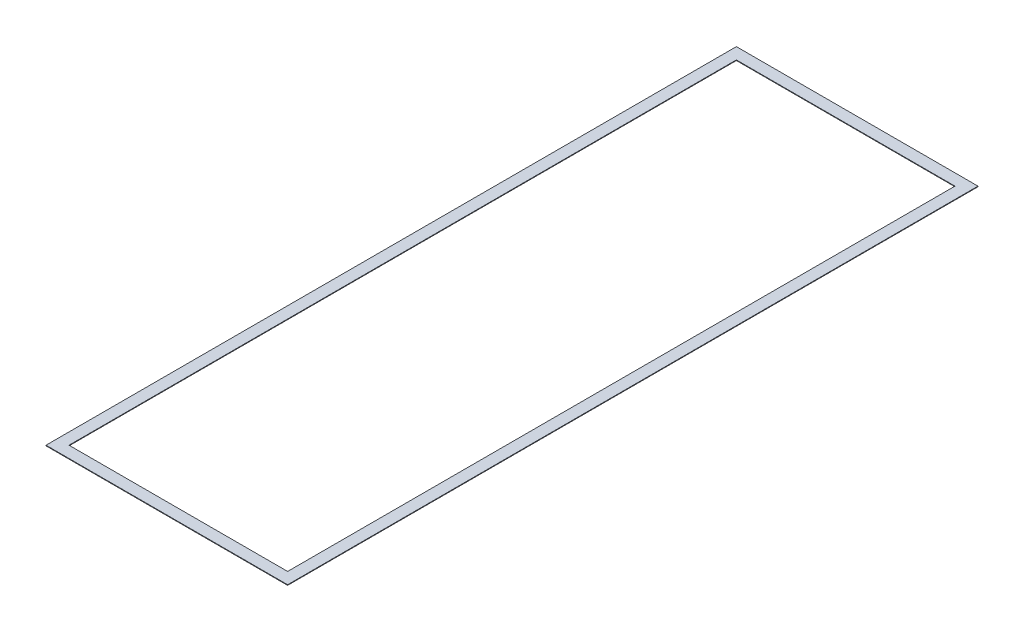
ISO-10303-21;
HEADER;
FILE_DESCRIPTION(('STEP AP214'),'2;1');
FILE_NAME('part.step','',(''),(''),'','','');
FILE_SCHEMA(('AUTOMOTIVE_DESIGN { 1 0 10303 214 1 1 1 1 }'));
ENDSEC;
DATA;
#1=APPLICATION_CONTEXT('core data for automotive mechanical design processes');
#2=APPLICATION_PROTOCOL_DEFINITION('international standard','automotive_design',2000,#1);
#3=PRODUCT_CONTEXT('',#1,'mechanical');
#4=PRODUCT('Part','Part','',(#3));
#5=PRODUCT_RELATED_PRODUCT_CATEGORY('part','',(#4));
#6=PRODUCT_DEFINITION_FORMATION('','',#4);
#7=PRODUCT_DEFINITION_CONTEXT('part definition',#1,'design');
#8=PRODUCT_DEFINITION('design','',#6,#7);
#9=PRODUCT_DEFINITION_SHAPE('','',#8);
#10=(LENGTH_UNIT() NAMED_UNIT(*) SI_UNIT(.MILLI.,.METRE.));
#11=(NAMED_UNIT(*) PLANE_ANGLE_UNIT() SI_UNIT($,.RADIAN.));
#12=(NAMED_UNIT(*) SI_UNIT($,.STERADIAN.) SOLID_ANGLE_UNIT());
#13=UNCERTAINTY_MEASURE_WITH_UNIT(LENGTH_MEASURE(1.E-05),#10,'distance_accuracy_value','');
#14=(GEOMETRIC_REPRESENTATION_CONTEXT(3) GLOBAL_UNCERTAINTY_ASSIGNED_CONTEXT((#13)) GLOBAL_UNIT_ASSIGNED_CONTEXT((#10,
#11,#12)) REPRESENTATION_CONTEXT('',''));
#15=CARTESIAN_POINT('',(0.,0.,0.));
#16=DIRECTION('',(0.,0.,1.));
#17=DIRECTION('',(1.,0.,0.));
#18=AXIS2_PLACEMENT_3D('',#15,#16,#17);
#19=CARTESIAN_POINT('',(0.,0.,0.));
#20=DIRECTION('',(0.,1.,0.));
#21=DIRECTION('',(0.,0.,1.));
#22=AXIS2_PLACEMENT_3D('',#19,#20,#21);
#23=PLANE('',#22);
#24=DIRECTION('',(1.,0.,0.));
#25=VECTOR('',#24,1.);
#26=CARTESIAN_POINT('',(-50.8,0.,-2997.2));
#27=LINE('',#26,#25);
#28=CARTESIAN_POINT('',(-1016.,0.,-2997.2));
#29=VERTEX_POINT('',#28);
#30=CARTESIAN_POINT('',(-50.8,0.,-2997.2));
#31=VERTEX_POINT('',#30);
#32=EDGE_CURVE('E109',#29,#31,#27,.T.);
#33=ORIENTED_EDGE('',*,*,#32,.F.);
#34=DIRECTION('',(0.,0.,-1.));
#35=VECTOR('',#34,1.);
#36=CARTESIAN_POINT('',(-1016.,0.,-50.8));
#37=LINE('',#36,#35);
#38=CARTESIAN_POINT('',(-1016.,0.,-50.8));
#39=VERTEX_POINT('',#38);
#40=EDGE_CURVE('E123',#39,#29,#37,.T.);
#41=ORIENTED_EDGE('',*,*,#40,.F.);
#42=DIRECTION('',(-1.,0.,0.));
#43=VECTOR('',#42,1.);
#44=CARTESIAN_POINT('',(-50.8,0.,-50.8));
#45=LINE('',#44,#43);
#46=CARTESIAN_POINT('',(-50.8,0.,-50.8));
#47=VERTEX_POINT('',#46);
#48=EDGE_CURVE('E118',#47,#39,#45,.T.);
#49=ORIENTED_EDGE('',*,*,#48,.F.);
#50=DIRECTION('',(0.,0.,1.));
#51=VECTOR('',#50,1.);
#52=CARTESIAN_POINT('',(-50.8,0.,-50.8));
#53=LINE('',#52,#51);
#54=EDGE_CURVE('E112',#31,#47,#53,.T.);
#55=ORIENTED_EDGE('',*,*,#54,.F.);
#56=EDGE_LOOP('',(#33,#41,#49,#55));
#57=FACE_BOUND('',#56,.T.);
#58=DIRECTION('',(-1.,0.,0.));
#59=VECTOR('',#58,1.);
#60=CARTESIAN_POINT('',(0.,0.,0.));
#61=LINE('',#60,#59);
#62=CARTESIAN_POINT('',(0.,0.,0.));
#63=VERTEX_POINT('',#62);
#64=CARTESIAN_POINT('',(-1066.8,0.,1.3064532053304E-13));
#65=VERTEX_POINT('',#64);
#66=EDGE_CURVE('E107',#63,#65,#61,.T.);
#67=ORIENTED_EDGE('',*,*,#66,.T.);
#68=DIRECTION('',(0.,0.,-1.));
#69=VECTOR('',#68,1.);
#70=CARTESIAN_POINT('',(-1066.8,0.,1.3064532053304E-13));
#71=LINE('',#70,#69);
#72=CARTESIAN_POINT('',(-1066.8,0.,-3048.));
#73=VERTEX_POINT('',#72);
#74=EDGE_CURVE('E93',#65,#73,#71,.T.);
#75=ORIENTED_EDGE('',*,*,#74,.T.);
#76=DIRECTION('',(1.,0.,0.));
#77=VECTOR('',#76,1.);
#78=CARTESIAN_POINT('',(0.,0.,-3048.));
#79=LINE('',#78,#77);
#80=CARTESIAN_POINT('',(0.,0.,-3048.));
#81=VERTEX_POINT('',#80);
#82=EDGE_CURVE('E80',#73,#81,#79,.T.);
#83=ORIENTED_EDGE('',*,*,#82,.T.);
#84=DIRECTION('',(0.,0.,1.));
#85=VECTOR('',#84,1.);
#86=CARTESIAN_POINT('',(0.,0.,0.));
#87=LINE('',#86,#85);
#88=EDGE_CURVE('E20',#81,#63,#87,.T.);
#89=ORIENTED_EDGE('',*,*,#88,.T.);
#90=EDGE_LOOP('',(#67,#75,#83,#89));
#91=FACE_BOUND('',#90,.T.);
#92=ADVANCED_FACE('F17',(#57,#91),#23,.F.);
#93=CARTESIAN_POINT('',(0.,2.54,0.));
#94=DIRECTION('',(-1.,0.,0.));
#95=DIRECTION('',(0.,0.,1.));
#96=AXIS2_PLACEMENT_3D('',#93,#94,#95);
#97=PLANE('',#96);
#98=DIRECTION('',(0.,1.,0.));
#99=VECTOR('',#98,1.);
#100=CARTESIAN_POINT('',(0.,2.54,-3048.));
#101=LINE('',#100,#99);
#102=CARTESIAN_POINT('',(0.,2.54,-3048.));
#103=VERTEX_POINT('',#102);
#104=EDGE_CURVE('E86',#81,#103,#101,.T.);
#105=ORIENTED_EDGE('',*,*,#104,.T.);
#106=DIRECTION('',(0.,0.,1.));
#107=VECTOR('',#106,1.);
#108=CARTESIAN_POINT('',(0.,2.54,0.));
#109=LINE('',#108,#107);
#110=CARTESIAN_POINT('',(0.,2.54,0.));
#111=VERTEX_POINT('',#110);
#112=EDGE_CURVE('E130',#111,#103,#109,.F.);
#113=ORIENTED_EDGE('',*,*,#112,.F.);
#114=DIRECTION('',(0.,1.,0.));
#115=VECTOR('',#114,1.);
#116=CARTESIAN_POINT('',(0.,2.54,0.));
#117=LINE('',#116,#115);
#118=EDGE_CURVE('E89',#111,#63,#117,.F.);
#119=ORIENTED_EDGE('',*,*,#118,.T.);
#120=ORIENTED_EDGE('',*,*,#88,.F.);
#121=EDGE_LOOP('',(#105,#113,#119,#120));
#122=FACE_BOUND('',#121,.T.);
#123=ADVANCED_FACE('F85',(#122),#97,.F.);
#124=CARTESIAN_POINT('',(0.,2.54,-3048.));
#125=DIRECTION('',(0.,0.,1.));
#126=DIRECTION('',(1.,0.,0.));
#127=AXIS2_PLACEMENT_3D('',#124,#125,#126);
#128=PLANE('',#127);
#129=DIRECTION('',(0.,1.,0.));
#130=VECTOR('',#129,1.);
#131=CARTESIAN_POINT('',(-1066.8,2.54,-3048.));
#132=LINE('',#131,#130);
#133=CARTESIAN_POINT('',(-1066.8,2.54,-3048.));
#134=VERTEX_POINT('',#133);
#135=EDGE_CURVE('E95',#73,#134,#132,.T.);
#136=ORIENTED_EDGE('',*,*,#135,.T.);
#137=DIRECTION('',(1.,0.,0.));
#138=VECTOR('',#137,1.);
#139=CARTESIAN_POINT('',(0.,2.54,-3048.));
#140=LINE('',#139,#138);
#141=EDGE_CURVE('E99',#103,#134,#140,.F.);
#142=ORIENTED_EDGE('',*,*,#141,.F.);
#143=ORIENTED_EDGE('',*,*,#104,.F.);
#144=ORIENTED_EDGE('',*,*,#82,.F.);
#145=EDGE_LOOP('',(#136,#142,#143,#144));
#146=FACE_BOUND('',#145,.T.);
#147=ADVANCED_FACE('F97',(#146),#128,.F.);
#148=CARTESIAN_POINT('',(-1066.8,2.54,1.3064532053304E-13));
#149=DIRECTION('',(1.,0.,0.));
#150=DIRECTION('',(0.,0.,-1.));
#151=AXIS2_PLACEMENT_3D('',#148,#149,#150);
#152=PLANE('',#151);
#153=DIRECTION('',(0.,1.,0.));
#154=VECTOR('',#153,1.);
#155=CARTESIAN_POINT('',(-1066.8,2.54,1.3064532053304E-13));
#156=LINE('',#155,#154);
#157=CARTESIAN_POINT('',(-1066.8,2.54,1.3064532053304E-13));
#158=VERTEX_POINT('',#157);
#159=EDGE_CURVE('E104',#65,#158,#156,.T.);
#160=ORIENTED_EDGE('',*,*,#159,.T.);
#161=DIRECTION('',(0.,0.,1.));
#162=VECTOR('',#161,1.);
#163=CARTESIAN_POINT('',(-1066.8,2.54,0.));
#164=LINE('',#163,#162);
#165=EDGE_CURVE('E133',#134,#158,#164,.T.);
#166=ORIENTED_EDGE('',*,*,#165,.F.);
#167=ORIENTED_EDGE('',*,*,#135,.F.);
#168=ORIENTED_EDGE('',*,*,#74,.F.);
#169=EDGE_LOOP('',(#160,#166,#167,#168));
#170=FACE_BOUND('',#169,.T.);
#171=ADVANCED_FACE('F176',(#170),#152,.F.);
#172=CARTESIAN_POINT('',(0.,2.54,0.));
#173=DIRECTION('',(0.,0.,-1.));
#174=DIRECTION('',(-1.,0.,0.));
#175=AXIS2_PLACEMENT_3D('',#172,#173,#174);
#176=PLANE('',#175);
#177=ORIENTED_EDGE('',*,*,#118,.F.);
#178=DIRECTION('',(1.,0.,0.));
#179=VECTOR('',#178,1.);
#180=CARTESIAN_POINT('',(0.,2.54,1.3064532053304E-13));
#181=LINE('',#180,#179);
#182=EDGE_CURVE('E136',#158,#111,#181,.T.);
#183=ORIENTED_EDGE('',*,*,#182,.F.);
#184=ORIENTED_EDGE('',*,*,#159,.F.);
#185=ORIENTED_EDGE('',*,*,#66,.F.);
#186=EDGE_LOOP('',(#177,#183,#184,#185));
#187=FACE_BOUND('',#186,.T.);
#188=ADVANCED_FACE('F173',(#187),#176,.F.);
#189=CARTESIAN_POINT('',(-50.8,2.54,-2997.2));
#190=DIRECTION('',(0.,0.,1.));
#191=DIRECTION('',(1.,0.,0.));
#192=AXIS2_PLACEMENT_3D('',#189,#190,#191);
#193=PLANE('',#192);
#194=DIRECTION('',(1.,0.,0.));
#195=VECTOR('',#194,1.);
#196=CARTESIAN_POINT('',(0.,2.54,-2997.2));
#197=LINE('',#196,#195);
#198=CARTESIAN_POINT('',(-1016.,2.54,-2997.2));
#199=VERTEX_POINT('',#198);
#200=CARTESIAN_POINT('',(-50.8,2.54,-2997.2));
#201=VERTEX_POINT('',#200);
#202=EDGE_CURVE('E139',#199,#201,#197,.T.);
#203=ORIENTED_EDGE('',*,*,#202,.F.);
#204=DIRECTION('',(0.,1.,0.));
#205=VECTOR('',#204,1.);
#206=CARTESIAN_POINT('',(-1016.,2.54,-2997.2));
#207=LINE('',#206,#205);
#208=EDGE_CURVE('E126',#29,#199,#207,.T.);
#209=ORIENTED_EDGE('',*,*,#208,.F.);
#210=ORIENTED_EDGE('',*,*,#32,.T.);
#211=DIRECTION('',(0.,1.,0.));
#212=VECTOR('',#211,1.);
#213=CARTESIAN_POINT('',(-50.8,2.54,-2997.2));
#214=LINE('',#213,#212);
#215=EDGE_CURVE('E115',#201,#31,#214,.F.);
#216=ORIENTED_EDGE('',*,*,#215,.F.);
#217=EDGE_LOOP('',(#203,#209,#210,#216));
#218=FACE_BOUND('',#217,.T.);
#219=ADVANCED_FACE('F156',(#218),#193,.T.);
#220=CARTESIAN_POINT('',(-50.8,2.54,-50.8));
#221=DIRECTION('',(-1.,0.,0.));
#222=DIRECTION('',(0.,0.,1.));
#223=AXIS2_PLACEMENT_3D('',#220,#221,#222);
#224=PLANE('',#223);
#225=DIRECTION('',(0.,0.,1.));
#226=VECTOR('',#225,1.);
#227=CARTESIAN_POINT('',(-50.8,2.54,0.));
#228=LINE('',#227,#226);
#229=CARTESIAN_POINT('',(-50.8,2.54,-50.8));
#230=VERTEX_POINT('',#229);
#231=EDGE_CURVE('E142',#201,#230,#228,.T.);
#232=ORIENTED_EDGE('',*,*,#231,.F.);
#233=ORIENTED_EDGE('',*,*,#215,.T.);
#234=ORIENTED_EDGE('',*,*,#54,.T.);
#235=DIRECTION('',(0.,1.,0.));
#236=VECTOR('',#235,1.);
#237=CARTESIAN_POINT('',(-50.8,2.54,-50.8));
#238=LINE('',#237,#236);
#239=EDGE_CURVE('E120',#230,#47,#238,.F.);
#240=ORIENTED_EDGE('',*,*,#239,.F.);
#241=EDGE_LOOP('',(#232,#233,#234,#240));
#242=FACE_BOUND('',#241,.T.);
#243=ADVANCED_FACE('F152',(#242),#224,.T.);
#244=CARTESIAN_POINT('',(-50.8,2.54,-50.8));
#245=DIRECTION('',(0.,0.,-1.));
#246=DIRECTION('',(-1.,0.,0.));
#247=AXIS2_PLACEMENT_3D('',#244,#245,#246);
#248=PLANE('',#247);
#249=DIRECTION('',(1.,0.,0.));
#250=VECTOR('',#249,1.);
#251=CARTESIAN_POINT('',(0.,2.54,-50.8));
#252=LINE('',#251,#250);
#253=CARTESIAN_POINT('',(-1016.,2.54,-50.8));
#254=VERTEX_POINT('',#253);
#255=EDGE_CURVE('E26',#230,#254,#252,.F.);
#256=ORIENTED_EDGE('',*,*,#255,.F.);
#257=ORIENTED_EDGE('',*,*,#239,.T.);
#258=ORIENTED_EDGE('',*,*,#48,.T.);
#259=DIRECTION('',(0.,1.,0.));
#260=VECTOR('',#259,1.);
#261=CARTESIAN_POINT('',(-1016.,2.54,-50.8));
#262=LINE('',#261,#260);
#263=EDGE_CURVE('E35',#254,#39,#262,.F.);
#264=ORIENTED_EDGE('',*,*,#263,.F.);
#265=EDGE_LOOP('',(#256,#257,#258,#264));
#266=FACE_BOUND('',#265,.T.);
#267=ADVANCED_FACE('F150',(#266),#248,.T.);
#268=CARTESIAN_POINT('',(-1016.,2.54,-50.8));
#269=DIRECTION('',(1.,0.,0.));
#270=DIRECTION('',(0.,0.,-1.));
#271=AXIS2_PLACEMENT_3D('',#268,#269,#270);
#272=PLANE('',#271);
#273=DIRECTION('',(0.,0.,1.));
#274=VECTOR('',#273,1.);
#275=CARTESIAN_POINT('',(-1016.,2.54,0.));
#276=LINE('',#275,#274);
#277=EDGE_CURVE('E11',#254,#199,#276,.F.);
#278=ORIENTED_EDGE('',*,*,#277,.F.);
#279=ORIENTED_EDGE('',*,*,#263,.T.);
#280=ORIENTED_EDGE('',*,*,#40,.T.);
#281=ORIENTED_EDGE('',*,*,#208,.T.);
#282=EDGE_LOOP('',(#278,#279,#280,#281));
#283=FACE_BOUND('',#282,.T.);
#284=ADVANCED_FACE('F158',(#283),#272,.T.);
#285=CARTESIAN_POINT('',(0.,2.54,0.));
#286=DIRECTION('',(0.,1.,0.));
#287=DIRECTION('',(0.,0.,1.));
#288=AXIS2_PLACEMENT_3D('',#285,#286,#287);
#289=PLANE('',#288);
#290=ORIENTED_EDGE('',*,*,#255,.T.);
#291=ORIENTED_EDGE('',*,*,#277,.T.);
#292=ORIENTED_EDGE('',*,*,#202,.T.);
#293=ORIENTED_EDGE('',*,*,#231,.T.);
#294=EDGE_LOOP('',(#290,#291,#292,#293));
#295=FACE_BOUND('',#294,.T.);
#296=ORIENTED_EDGE('',*,*,#165,.T.);
#297=ORIENTED_EDGE('',*,*,#182,.T.);
#298=ORIENTED_EDGE('',*,*,#112,.T.);
#299=ORIENTED_EDGE('',*,*,#141,.T.);
#300=EDGE_LOOP('',(#296,#297,#298,#299));
#301=FACE_BOUND('',#300,.T.);
#302=ADVANCED_FACE('F147',(#295,#301),#289,.T.);
#303=CLOSED_SHELL('',(#92,#123,#147,#171,#188,#219,#243,#267,#284,#302));
#304=MANIFOLD_SOLID_BREP('B1',#303);
#305=ADVANCED_BREP_SHAPE_REPRESENTATION('',(#18,#304),#14);
#306=SHAPE_DEFINITION_REPRESENTATION(#9,#305);
ENDSEC;
END-ISO-10303-21;
